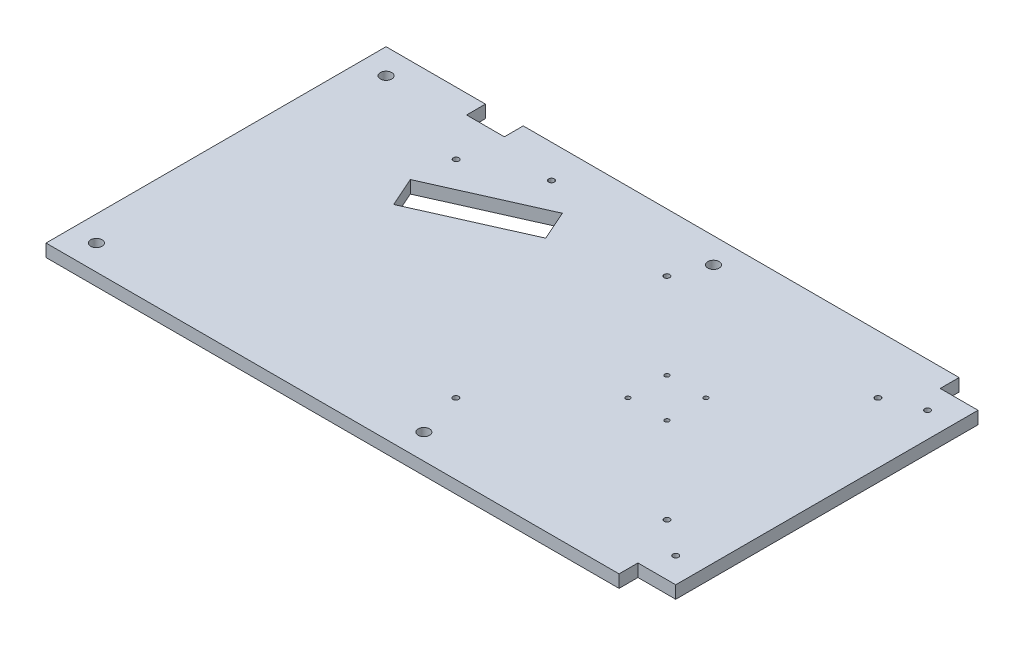
ISO-10303-21;
HEADER;
FILE_DESCRIPTION(('STEP AP214'),'2;1');
FILE_NAME('part.step','',(''),(''),'','','');
FILE_SCHEMA(('AUTOMOTIVE_DESIGN { 1 0 10303 214 1 1 1 1 }'));
ENDSEC;
DATA;
#1=APPLICATION_CONTEXT('core data for automotive mechanical design processes');
#2=APPLICATION_PROTOCOL_DEFINITION('international standard','automotive_design',2000,#1);
#3=PRODUCT_CONTEXT('',#1,'mechanical');
#4=PRODUCT('Part','Part','',(#3));
#5=PRODUCT_RELATED_PRODUCT_CATEGORY('part','',(#4));
#6=PRODUCT_DEFINITION_FORMATION('','',#4);
#7=PRODUCT_DEFINITION_CONTEXT('part definition',#1,'design');
#8=PRODUCT_DEFINITION('design','',#6,#7);
#9=PRODUCT_DEFINITION_SHAPE('','',#8);
#10=(LENGTH_UNIT() NAMED_UNIT(*) SI_UNIT(.MILLI.,.METRE.));
#11=(NAMED_UNIT(*) PLANE_ANGLE_UNIT() SI_UNIT($,.RADIAN.));
#12=(NAMED_UNIT(*) SI_UNIT($,.STERADIAN.) SOLID_ANGLE_UNIT());
#13=UNCERTAINTY_MEASURE_WITH_UNIT(LENGTH_MEASURE(1.E-05),#10,'distance_accuracy_value','');
#14=(GEOMETRIC_REPRESENTATION_CONTEXT(3) GLOBAL_UNCERTAINTY_ASSIGNED_CONTEXT((#13)) GLOBAL_UNIT_ASSIGNED_CONTEXT((#10,
#11,#12)) REPRESENTATION_CONTEXT('',''));
#15=CARTESIAN_POINT('',(0.,0.,0.));
#16=DIRECTION('',(0.,0.,1.));
#17=DIRECTION('',(1.,0.,0.));
#18=AXIS2_PLACEMENT_3D('',#15,#16,#17);
#19=CARTESIAN_POINT('',(0.,10.,-270.));
#20=DIRECTION('',(0.,0.,1.));
#21=DIRECTION('',(1.,0.,0.));
#22=AXIS2_PLACEMENT_3D('',#19,#20,#21);
#23=PLANE('',#22);
#24=DIRECTION('',(-1.,0.,0.));
#25=VECTOR('',#24,1.);
#26=CARTESIAN_POINT('',(0.,10.,-270.));
#27=LINE('',#26,#25);
#28=CARTESIAN_POINT('',(-406.074312,10.,-270.));
#29=VERTEX_POINT('',#28);
#30=CARTESIAN_POINT('',(-485.,10.,-270.));
#31=VERTEX_POINT('',#30);
#32=EDGE_CURVE('E317',#29,#31,#27,.T.);
#33=ORIENTED_EDGE('',*,*,#32,.F.);
#34=DIRECTION('',(0.,1.,0.));
#35=VECTOR('',#34,1.);
#36=CARTESIAN_POINT('',(-406.074312,0.,-270.));
#37=LINE('',#36,#35);
#38=CARTESIAN_POINT('',(-406.074312,0.,-270.));
#39=VERTEX_POINT('',#38);
#40=EDGE_CURVE('E337',#39,#29,#37,.T.);
#41=ORIENTED_EDGE('',*,*,#40,.F.);
#42=DIRECTION('',(-1.,0.,0.));
#43=VECTOR('',#42,1.);
#44=CARTESIAN_POINT('',(0.,0.,-270.));
#45=LINE('',#44,#43);
#46=CARTESIAN_POINT('',(-485.,0.,-270.));
#47=VERTEX_POINT('',#46);
#48=EDGE_CURVE('E187',#39,#47,#45,.T.);
#49=ORIENTED_EDGE('',*,*,#48,.T.);
#50=DIRECTION('',(0.,-1.,0.));
#51=VECTOR('',#50,1.);
#52=CARTESIAN_POINT('',(-485.,10.,-270.));
#53=LINE('',#52,#51);
#54=EDGE_CURVE('E11',#31,#47,#53,.T.);
#55=ORIENTED_EDGE('',*,*,#54,.F.);
#56=EDGE_LOOP('',(#33,#41,#49,#55));
#57=FACE_BOUND('',#56,.T.);
#58=ADVANCED_FACE('F37',(#57),#23,.F.);
#59=CARTESIAN_POINT('',(0.,10.,0.));
#60=DIRECTION('',(-1.,0.,0.));
#61=DIRECTION('',(0.,0.,1.));
#62=AXIS2_PLACEMENT_3D('',#59,#60,#61);
#63=PLANE('',#62);
#64=DIRECTION('',(0.,0.,-1.));
#65=VECTOR('',#64,1.);
#66=CARTESIAN_POINT('',(0.,10.,0.));
#67=LINE('',#66,#65);
#68=CARTESIAN_POINT('',(0.,10.,-15.));
#69=VERTEX_POINT('',#68);
#70=CARTESIAN_POINT('',(0.,10.,-255.));
#71=VERTEX_POINT('',#70);
#72=EDGE_CURVE('E193',#69,#71,#67,.T.);
#73=ORIENTED_EDGE('',*,*,#72,.F.);
#74=DIRECTION('',(0.,1.,0.));
#75=VECTOR('',#74,1.);
#76=CARTESIAN_POINT('',(0.,0.,-15.));
#77=LINE('',#76,#75);
#78=CARTESIAN_POINT('',(0.,0.,-15.));
#79=VERTEX_POINT('',#78);
#80=EDGE_CURVE('E501',#79,#69,#77,.T.);
#81=ORIENTED_EDGE('',*,*,#80,.F.);
#82=DIRECTION('',(0.,0.,-1.));
#83=VECTOR('',#82,1.);
#84=CARTESIAN_POINT('',(0.,0.,0.));
#85=LINE('',#84,#83);
#86=CARTESIAN_POINT('',(0.,0.,-255.));
#87=VERTEX_POINT('',#86);
#88=EDGE_CURVE('E184',#79,#87,#85,.T.);
#89=ORIENTED_EDGE('',*,*,#88,.T.);
#90=DIRECTION('',(0.,1.,0.));
#91=VECTOR('',#90,1.);
#92=CARTESIAN_POINT('',(0.,0.,-255.));
#93=LINE('',#92,#91);
#94=EDGE_CURVE('E230',#87,#71,#93,.T.);
#95=ORIENTED_EDGE('',*,*,#94,.T.);
#96=EDGE_LOOP('',(#73,#81,#89,#95));
#97=FACE_BOUND('',#96,.T.);
#98=ADVANCED_FACE('F39',(#97),#63,.F.);
#99=CARTESIAN_POINT('',(-30.,0.,-270.));
#100=VERTEX_POINT('',#99);
#101=CARTESIAN_POINT('',(-376.074312,0.,-270.));
#102=VERTEX_POINT('',#101);
#103=EDGE_CURVE('E190',#100,#102,#45,.T.);
#104=ORIENTED_EDGE('',*,*,#103,.T.);
#105=DIRECTION('',(0.,1.,0.));
#106=VECTOR('',#105,1.);
#107=CARTESIAN_POINT('',(-376.074312,0.,-270.));
#108=LINE('',#107,#106);
#109=CARTESIAN_POINT('',(-376.074312,10.,-270.));
#110=VERTEX_POINT('',#109);
#111=EDGE_CURVE('E335',#102,#110,#108,.T.);
#112=ORIENTED_EDGE('',*,*,#111,.T.);
#113=CARTESIAN_POINT('',(-30.,10.,-270.));
#114=VERTEX_POINT('',#113);
#115=EDGE_CURVE('E180',#114,#110,#27,.T.);
#116=ORIENTED_EDGE('',*,*,#115,.F.);
#117=DIRECTION('',(0.,1.,0.));
#118=VECTOR('',#117,1.);
#119=CARTESIAN_POINT('',(-30.,0.,-270.));
#120=LINE('',#119,#118);
#121=EDGE_CURVE('E233',#100,#114,#120,.T.);
#122=ORIENTED_EDGE('',*,*,#121,.F.);
#123=EDGE_LOOP('',(#104,#112,#116,#122));
#124=FACE_BOUND('',#123,.T.);
#125=ADVANCED_FACE('F333',(#124),#23,.F.);
#126=CARTESIAN_POINT('',(-485.,10.,0.));
#127=DIRECTION('',(1.,0.,0.));
#128=DIRECTION('',(0.,0.,-1.));
#129=AXIS2_PLACEMENT_3D('',#126,#127,#128);
#130=PLANE('',#129);
#131=DIRECTION('',(0.,0.,1.));
#132=VECTOR('',#131,1.);
#133=CARTESIAN_POINT('',(-485.,0.,0.));
#134=LINE('',#133,#132);
#135=CARTESIAN_POINT('',(-485.,0.,0.));
#136=VERTEX_POINT('',#135);
#137=EDGE_CURVE('E191',#47,#136,#134,.T.);
#138=ORIENTED_EDGE('',*,*,#137,.T.);
#139=DIRECTION('',(0.,-1.,0.));
#140=VECTOR('',#139,1.);
#141=CARTESIAN_POINT('',(-485.,10.,0.));
#142=LINE('',#141,#140);
#143=CARTESIAN_POINT('',(-485.,10.,0.));
#144=VERTEX_POINT('',#143);
#145=EDGE_CURVE('E46',#144,#136,#142,.T.);
#146=ORIENTED_EDGE('',*,*,#145,.F.);
#147=DIRECTION('',(0.,0.,1.));
#148=VECTOR('',#147,1.);
#149=CARTESIAN_POINT('',(-485.,10.,0.));
#150=LINE('',#149,#148);
#151=EDGE_CURVE('E176',#31,#144,#150,.T.);
#152=ORIENTED_EDGE('',*,*,#151,.F.);
#153=ORIENTED_EDGE('',*,*,#54,.T.);
#154=EDGE_LOOP('',(#138,#146,#152,#153));
#155=FACE_BOUND('',#154,.T.);
#156=ADVANCED_FACE('F403',(#155),#130,.F.);
#157=CARTESIAN_POINT('',(0.,10.,0.));
#158=DIRECTION('',(0.,0.,-1.));
#159=DIRECTION('',(-1.,0.,0.));
#160=AXIS2_PLACEMENT_3D('',#157,#158,#159);
#161=PLANE('',#160);
#162=DIRECTION('',(1.,0.,0.));
#163=VECTOR('',#162,1.);
#164=CARTESIAN_POINT('',(0.,0.,0.));
#165=LINE('',#164,#163);
#166=CARTESIAN_POINT('',(-30.,0.,0.));
#167=VERTEX_POINT('',#166);
#168=EDGE_CURVE('E169',#136,#167,#165,.T.);
#169=ORIENTED_EDGE('',*,*,#168,.T.);
#170=DIRECTION('',(0.,1.,0.));
#171=VECTOR('',#170,1.);
#172=CARTESIAN_POINT('',(-30.,0.,0.));
#173=LINE('',#172,#171);
#174=CARTESIAN_POINT('',(-30.,10.,0.));
#175=VERTEX_POINT('',#174);
#176=EDGE_CURVE('E153',#167,#175,#173,.T.);
#177=ORIENTED_EDGE('',*,*,#176,.T.);
#178=DIRECTION('',(1.,0.,0.));
#179=VECTOR('',#178,1.);
#180=CARTESIAN_POINT('',(0.,10.,0.));
#181=LINE('',#180,#179);
#182=EDGE_CURVE('E167',#144,#175,#181,.T.);
#183=ORIENTED_EDGE('',*,*,#182,.F.);
#184=ORIENTED_EDGE('',*,*,#145,.T.);
#185=EDGE_LOOP('',(#169,#177,#183,#184));
#186=FACE_BOUND('',#185,.T.);
#187=ADVANCED_FACE('F165',(#186),#161,.F.);
#188=CARTESIAN_POINT('',(0.,10.,0.));
#189=DIRECTION('',(0.,1.,0.));
#190=DIRECTION('',(0.,0.,1.));
#191=AXIS2_PLACEMENT_3D('',#188,#189,#190);
#192=PLANE('',#191);
#193=CARTESIAN_POINT('',(-20.,10.,-35.));
#194=DIRECTION('',(0.,1.,0.));
#195=DIRECTION('',(0.,0.,1.));
#196=AXIS2_PLACEMENT_3D('',#193,#194,#195);
#197=CIRCLE('',#196,2.25);
#198=CARTESIAN_POINT('',(-20.,10.,-32.75));
#199=VERTEX_POINT('',#198);
#200=EDGE_CURVE('E512',#199,#199,#197,.T.);
#201=ORIENTED_EDGE('',*,*,#200,.F.);
#202=EDGE_LOOP('',(#201));
#203=FACE_BOUND('',#202,.T.);
#204=CARTESIAN_POINT('',(-20.,10.,-235.));
#205=DIRECTION('',(0.,1.,0.));
#206=DIRECTION('',(0.,0.,1.));
#207=AXIS2_PLACEMENT_3D('',#204,#205,#206);
#208=CIRCLE('',#207,2.25);
#209=CARTESIAN_POINT('',(-20.,10.,-232.75));
#210=VERTEX_POINT('',#209);
#211=EDGE_CURVE('E509',#210,#210,#208,.T.);
#212=ORIENTED_EDGE('',*,*,#211,.F.);
#213=EDGE_LOOP('',(#212));
#214=FACE_BOUND('',#213,.T.);
#215=DIRECTION('',(0.,0.,1.));
#216=VECTOR('',#215,1.);
#217=CARTESIAN_POINT('',(-406.074312,10.,-255.));
#218=LINE('',#217,#216);
#219=CARTESIAN_POINT('',(-406.074312,10.,-255.));
#220=VERTEX_POINT('',#219);
#221=EDGE_CURVE('E170',#29,#220,#218,.T.);
#222=ORIENTED_EDGE('',*,*,#221,.F.);
#223=ORIENTED_EDGE('',*,*,#32,.T.);
#224=ORIENTED_EDGE('',*,*,#151,.T.);
#225=ORIENTED_EDGE('',*,*,#182,.T.);
#226=DIRECTION('',(0.,0.,1.));
#227=VECTOR('',#226,1.);
#228=CARTESIAN_POINT('',(-30.,10.,0.));
#229=LINE('',#228,#227);
#230=CARTESIAN_POINT('',(-30.,10.,-15.));
#231=VERTEX_POINT('',#230);
#232=EDGE_CURVE('E150',#231,#175,#229,.T.);
#233=ORIENTED_EDGE('',*,*,#232,.F.);
#234=DIRECTION('',(-1.,0.,0.));
#235=VECTOR('',#234,1.);
#236=CARTESIAN_POINT('',(0.,10.,-15.));
#237=LINE('',#236,#235);
#238=EDGE_CURVE('E159',#69,#231,#237,.T.);
#239=ORIENTED_EDGE('',*,*,#238,.F.);
#240=ORIENTED_EDGE('',*,*,#72,.T.);
#241=DIRECTION('',(1.,0.,0.));
#242=VECTOR('',#241,1.);
#243=CARTESIAN_POINT('',(0.,10.,-255.));
#244=LINE('',#243,#242);
#245=CARTESIAN_POINT('',(-30.,10.,-255.));
#246=VERTEX_POINT('',#245);
#247=EDGE_CURVE('E362',#246,#71,#244,.T.);
#248=ORIENTED_EDGE('',*,*,#247,.F.);
#249=DIRECTION('',(0.,0.,1.));
#250=VECTOR('',#249,1.);
#251=CARTESIAN_POINT('',(-30.,10.,-270.));
#252=LINE('',#251,#250);
#253=EDGE_CURVE('E328',#114,#246,#252,.T.);
#254=ORIENTED_EDGE('',*,*,#253,.F.);
#255=ORIENTED_EDGE('',*,*,#115,.T.);
#256=DIRECTION('',(0.,0.,-1.));
#257=VECTOR('',#256,1.);
#258=CARTESIAN_POINT('',(-376.074312,10.,-255.));
#259=LINE('',#258,#257);
#260=CARTESIAN_POINT('',(-376.074312,10.,-255.));
#261=VERTEX_POINT('',#260);
#262=EDGE_CURVE('E325',#261,#110,#259,.T.);
#263=ORIENTED_EDGE('',*,*,#262,.F.);
#264=DIRECTION('',(1.,0.,0.));
#265=VECTOR('',#264,1.);
#266=CARTESIAN_POINT('',(-406.074312,10.,-255.));
#267=LINE('',#266,#265);
#268=EDGE_CURVE('E346',#220,#261,#267,.T.);
#269=ORIENTED_EDGE('',*,*,#268,.F.);
#270=EDGE_LOOP('',(#222,#223,#224,#225,#233,#239,#240,#248,#254,#255,#263,#269));
#271=FACE_BOUND('',#270,.T.);
#272=CARTESIAN_POINT('',(-327.299756601943,10.,-243.651595894783));
#273=DIRECTION('',(0.,1.,0.));
#274=DIRECTION('',(0.,0.,1.));
#275=AXIS2_PLACEMENT_3D('',#272,#273,#274);
#276=CIRCLE('',#275,2.25000000000001);
#277=CARTESIAN_POINT('',(-327.299756601943,10.,-241.401595894783));
#278=VERTEX_POINT('',#277);
#279=EDGE_CURVE('E219',#278,#278,#276,.T.);
#280=ORIENTED_EDGE('',*,*,#279,.F.);
#281=EDGE_LOOP('',(#280));
#282=FACE_BOUND('',#281,.T.);
#283=CARTESIAN_POINT('',(-379.645911324864,10.,-220.345586246539));
#284=DIRECTION('',(0.,1.,0.));
#285=DIRECTION('',(0.,0.,1.));
#286=AXIS2_PLACEMENT_3D('',#283,#284,#285);
#287=CIRCLE('',#286,2.25000000000001);
#288=CARTESIAN_POINT('',(-379.645911324864,10.,-218.095586246539));
#289=VERTEX_POINT('',#288);
#290=EDGE_CURVE('E225',#289,#289,#287,.T.);
#291=ORIENTED_EDGE('',*,*,#290,.F.);
#292=EDGE_LOOP('',(#291));
#293=FACE_BOUND('',#292,.T.);
#294=CARTESIAN_POINT('',(-147.5,10.,-124.5));
#295=DIRECTION('',(0.,1.,0.));
#296=DIRECTION('',(0.,0.,1.));
#297=AXIS2_PLACEMENT_3D('',#294,#295,#296);
#298=CIRCLE('',#297,1.75000000000001);
#299=CARTESIAN_POINT('',(-147.5,10.,-122.75));
#300=VERTEX_POINT('',#299);
#301=EDGE_CURVE('E223',#300,#300,#298,.T.);
#302=ORIENTED_EDGE('',*,*,#301,.F.);
#303=EDGE_LOOP('',(#302));
#304=FACE_BOUND('',#303,.T.);
#305=CARTESIAN_POINT('',(-116.5,10.,-124.5));
#306=DIRECTION('',(0.,1.,0.));
#307=DIRECTION('',(0.,0.,1.));
#308=AXIS2_PLACEMENT_3D('',#305,#306,#307);
#309=CIRCLE('',#308,1.74999999999997);
#310=CARTESIAN_POINT('',(-116.5,10.,-122.75));
#311=VERTEX_POINT('',#310);
#312=EDGE_CURVE('E239',#311,#311,#309,.T.);
#313=ORIENTED_EDGE('',*,*,#312,.F.);
#314=EDGE_LOOP('',(#313));
#315=FACE_BOUND('',#314,.T.);
#316=CARTESIAN_POINT('',(-116.5,10.,-155.5));
#317=DIRECTION('',(0.,1.,0.));
#318=DIRECTION('',(0.,0.,1.));
#319=AXIS2_PLACEMENT_3D('',#316,#317,#318);
#320=CIRCLE('',#319,1.75);
#321=CARTESIAN_POINT('',(-116.5,10.,-153.75));
#322=VERTEX_POINT('',#321);
#323=EDGE_CURVE('E236',#322,#322,#320,.T.);
#324=ORIENTED_EDGE('',*,*,#323,.F.);
#325=EDGE_LOOP('',(#324));
#326=FACE_BOUND('',#325,.T.);
#327=CARTESIAN_POINT('',(-147.5,10.,-155.5));
#328=DIRECTION('',(0.,1.,0.));
#329=DIRECTION('',(0.,0.,1.));
#330=AXIS2_PLACEMENT_3D('',#327,#328,#329);
#331=CIRCLE('',#330,1.75000000000001);
#332=CARTESIAN_POINT('',(-147.5,10.,-153.75));
#333=VERTEX_POINT('',#332);
#334=EDGE_CURVE('E208',#333,#333,#331,.T.);
#335=ORIENTED_EDGE('',*,*,#334,.F.);
#336=EDGE_LOOP('',(#335));
#337=FACE_BOUND('',#336,.T.);
#338=CARTESIAN_POINT('',(-48.2078464293937,10.,-56.2078464293948));
#339=DIRECTION('',(0.,1.,0.));
#340=DIRECTION('',(0.,0.,1.));
#341=AXIS2_PLACEMENT_3D('',#338,#339,#340);
#342=CIRCLE('',#341,2.25000000000007);
#343=CARTESIAN_POINT('',(-48.2078464293937,10.,-53.9578464293948));
#344=VERTEX_POINT('',#343);
#345=EDGE_CURVE('E259',#344,#344,#342,.T.);
#346=ORIENTED_EDGE('',*,*,#345,.F.);
#347=EDGE_LOOP('',(#346));
#348=FACE_BOUND('',#347,.T.);
#349=CARTESIAN_POINT('',(-215.792153570606,10.,-223.792153570606));
#350=DIRECTION('',(0.,1.,0.));
#351=DIRECTION('',(0.,0.,1.));
#352=AXIS2_PLACEMENT_3D('',#349,#350,#351);
#353=CIRCLE('',#352,2.25000000000001);
#354=CARTESIAN_POINT('',(-215.792153570606,10.,-221.542153570606));
#355=VERTEX_POINT('',#354);
#356=EDGE_CURVE('E253',#355,#355,#353,.T.);
#357=ORIENTED_EDGE('',*,*,#356,.F.);
#358=EDGE_LOOP('',(#357));
#359=FACE_BOUND('',#358,.T.);
#360=CARTESIAN_POINT('',(-215.792153570605,10.,-56.207846429394));
#361=DIRECTION('',(0.,1.,0.));
#362=DIRECTION('',(0.,0.,1.));
#363=AXIS2_PLACEMENT_3D('',#360,#361,#362);
#364=CIRCLE('',#363,2.24999999999998);
#365=CARTESIAN_POINT('',(-215.792153570605,10.,-53.957846429394));
#366=VERTEX_POINT('',#365);
#367=EDGE_CURVE('E246',#366,#366,#364,.T.);
#368=ORIENTED_EDGE('',*,*,#367,.F.);
#369=EDGE_LOOP('',(#368));
#370=FACE_BOUND('',#369,.T.);
#371=CARTESIAN_POINT('',(-48.2078464293946,10.,-223.792153570607));
#372=DIRECTION('',(0.,1.,0.));
#373=DIRECTION('',(0.,0.,1.));
#374=AXIS2_PLACEMENT_3D('',#371,#372,#373);
#375=CIRCLE('',#374,2.25000000000002);
#376=CARTESIAN_POINT('',(-48.2078464293946,10.,-221.542153570607));
#377=VERTEX_POINT('',#376);
#378=EDGE_CURVE('E249',#377,#377,#375,.T.);
#379=ORIENTED_EDGE('',*,*,#378,.F.);
#380=EDGE_LOOP('',(#379));
#381=FACE_BOUND('',#380,.T.);
#382=DIRECTION('',(0.913545457642599,0.,-0.406736643075804));
#383=VECTOR('',#382,1.);
#384=CARTESIAN_POINT('',(-122.920536952595,10.0000000000001,-276.084046263576));
#385=LINE('',#384,#383);
#386=CARTESIAN_POINT('',(-373.483747125887,10.,-164.526117611434));
#387=VERTEX_POINT('',#386);
#388=CARTESIAN_POINT('',(-289.941100154142,10.,-201.721700489859));
#389=VERTEX_POINT('',#388);
#390=EDGE_CURVE('E282',#387,#389,#385,.T.);
#391=ORIENTED_EDGE('',*,*,#390,.F.);
#392=DIRECTION('',(-0.406736643075804,0.,-0.913545457642599));
#393=VECTOR('',#392,1.);
#394=CARTESIAN_POINT('',(-373.483747125887,10.,-164.526117611434));
#395=LINE('',#394,#393);
#396=CARTESIAN_POINT('',(-384.058899845858,10.,-188.278299510141));
#397=VERTEX_POINT('',#396);
#398=EDGE_CURVE('E296',#387,#397,#395,.T.);
#399=ORIENTED_EDGE('',*,*,#398,.T.);
#400=DIRECTION('',(0.913545457642599,0.,-0.406736643075804));
#401=VECTOR('',#400,1.);
#402=CARTESIAN_POINT('',(-133.495689672566,10.0000000000001,-299.836228162284));
#403=LINE('',#402,#401);
#404=CARTESIAN_POINT('',(-300.516252874113,10.,-225.473882388567));
#405=VERTEX_POINT('',#404);
#406=EDGE_CURVE('E271',#397,#405,#403,.T.);
#407=ORIENTED_EDGE('',*,*,#406,.T.);
#408=DIRECTION('',(-0.406736643075804,0.,-0.913545457642599));
#409=VECTOR('',#408,1.);
#410=CARTESIAN_POINT('',(-289.941100154142,10.,-201.721700489859));
#411=LINE('',#410,#409);
#412=EDGE_CURVE('E299',#389,#405,#411,.T.);
#413=ORIENTED_EDGE('',*,*,#412,.F.);
#414=EDGE_LOOP('',(#391,#399,#407,#413));
#415=FACE_BOUND('',#414,.T.);
#416=CARTESIAN_POINT('',(-465.,10.,-250.));
#417=DIRECTION('',(0.,1.,0.));
#418=DIRECTION('',(0.,0.,1.));
#419=AXIS2_PLACEMENT_3D('',#416,#417,#418);
#420=CIRCLE('',#419,4.5);
#421=CARTESIAN_POINT('',(-465.,10.,-245.5));
#422=VERTEX_POINT('',#421);
#423=EDGE_CURVE('E203',#422,#422,#420,.T.);
#424=ORIENTED_EDGE('',*,*,#423,.F.);
#425=EDGE_LOOP('',(#424));
#426=FACE_BOUND('',#425,.T.);
#427=CARTESIAN_POINT('',(-205.,10.,-19.9999999999999));
#428=DIRECTION('',(0.,1.,0.));
#429=DIRECTION('',(0.,0.,1.));
#430=AXIS2_PLACEMENT_3D('',#427,#428,#429);
#431=CIRCLE('',#430,4.49999999999998);
#432=CARTESIAN_POINT('',(-205.,10.,-15.5));
#433=VERTEX_POINT('',#432);
#434=EDGE_CURVE('E199',#433,#433,#431,.T.);
#435=ORIENTED_EDGE('',*,*,#434,.F.);
#436=EDGE_LOOP('',(#435));
#437=FACE_BOUND('',#436,.T.);
#438=CARTESIAN_POINT('',(-465.,10.,-19.9999999999999));
#439=DIRECTION('',(0.,1.,0.));
#440=DIRECTION('',(0.,0.,1.));
#441=AXIS2_PLACEMENT_3D('',#438,#439,#440);
#442=CIRCLE('',#441,4.5);
#443=CARTESIAN_POINT('',(-465.,10.,-15.4999999999999));
#444=VERTEX_POINT('',#443);
#445=EDGE_CURVE('E198',#444,#444,#442,.T.);
#446=ORIENTED_EDGE('',*,*,#445,.F.);
#447=EDGE_LOOP('',(#446));
#448=FACE_BOUND('',#447,.T.);
#449=CARTESIAN_POINT('',(-205.,10.,-250.));
#450=DIRECTION('',(0.,1.,0.));
#451=DIRECTION('',(0.,0.,1.));
#452=AXIS2_PLACEMENT_3D('',#449,#450,#451);
#453=CIRCLE('',#452,4.5);
#454=CARTESIAN_POINT('',(-205.,10.,-245.5));
#455=VERTEX_POINT('',#454);
#456=EDGE_CURVE('E311',#455,#455,#453,.T.);
#457=ORIENTED_EDGE('',*,*,#456,.F.);
#458=EDGE_LOOP('',(#457));
#459=FACE_BOUND('',#458,.T.);
#460=ADVANCED_FACE('F173',(#203,#214,#271,#282,#293,#304,#315,#326,#337,#348,#359,#370,#381,
#415,#426,#437,#448,#459),#192,.T.);
#461=CARTESIAN_POINT('',(0.,0.,0.));
#462=DIRECTION('',(0.,1.,0.));
#463=DIRECTION('',(0.,0.,1.));
#464=AXIS2_PLACEMENT_3D('',#461,#462,#463);
#465=PLANE('',#464);
#466=CARTESIAN_POINT('',(-20.,0.,-35.));
#467=DIRECTION('',(0.,1.,0.));
#468=DIRECTION('',(0.,0.,1.));
#469=AXIS2_PLACEMENT_3D('',#466,#467,#468);
#470=CIRCLE('',#469,2.25);
#471=CARTESIAN_POINT('',(-20.,0.,-32.75));
#472=VERTEX_POINT('',#471);
#473=EDGE_CURVE('E341',#472,#472,#470,.T.);
#474=ORIENTED_EDGE('',*,*,#473,.T.);
#475=EDGE_LOOP('',(#474));
#476=FACE_BOUND('',#475,.T.);
#477=CARTESIAN_POINT('',(-20.,0.,-235.));
#478=DIRECTION('',(0.,1.,0.));
#479=DIRECTION('',(0.,0.,1.));
#480=AXIS2_PLACEMENT_3D('',#477,#478,#479);
#481=CIRCLE('',#480,2.25);
#482=CARTESIAN_POINT('',(-20.,0.,-232.75));
#483=VERTEX_POINT('',#482);
#484=EDGE_CURVE('E506',#483,#483,#481,.T.);
#485=ORIENTED_EDGE('',*,*,#484,.T.);
#486=EDGE_LOOP('',(#485));
#487=FACE_BOUND('',#486,.T.);
#488=ORIENTED_EDGE('',*,*,#48,.F.);
#489=DIRECTION('',(0.,0.,1.));
#490=VECTOR('',#489,1.);
#491=CARTESIAN_POINT('',(-406.074312,0.,-255.));
#492=LINE('',#491,#490);
#493=CARTESIAN_POINT('',(-406.074312,0.,-255.));
#494=VERTEX_POINT('',#493);
#495=EDGE_CURVE('E347',#39,#494,#492,.T.);
#496=ORIENTED_EDGE('',*,*,#495,.T.);
#497=DIRECTION('',(1.,0.,0.));
#498=VECTOR('',#497,1.);
#499=CARTESIAN_POINT('',(-406.074312,0.,-255.));
#500=LINE('',#499,#498);
#501=CARTESIAN_POINT('',(-376.074312,0.,-255.));
#502=VERTEX_POINT('',#501);
#503=EDGE_CURVE('E353',#494,#502,#500,.T.);
#504=ORIENTED_EDGE('',*,*,#503,.T.);
#505=DIRECTION('',(0.,0.,-1.));
#506=VECTOR('',#505,1.);
#507=CARTESIAN_POINT('',(-376.074312,0.,-255.));
#508=LINE('',#507,#506);
#509=EDGE_CURVE('E54',#502,#102,#508,.T.);
#510=ORIENTED_EDGE('',*,*,#509,.T.);
#511=ORIENTED_EDGE('',*,*,#103,.F.);
#512=DIRECTION('',(0.,0.,1.));
#513=VECTOR('',#512,1.);
#514=CARTESIAN_POINT('',(-30.,0.,-270.));
#515=LINE('',#514,#513);
#516=CARTESIAN_POINT('',(-30.,0.,-255.));
#517=VERTEX_POINT('',#516);
#518=EDGE_CURVE('E358',#100,#517,#515,.T.);
#519=ORIENTED_EDGE('',*,*,#518,.T.);
#520=DIRECTION('',(1.,0.,0.));
#521=VECTOR('',#520,1.);
#522=CARTESIAN_POINT('',(0.,0.,-255.));
#523=LINE('',#522,#521);
#524=EDGE_CURVE('E361',#517,#87,#523,.T.);
#525=ORIENTED_EDGE('',*,*,#524,.T.);
#526=ORIENTED_EDGE('',*,*,#88,.F.);
#527=DIRECTION('',(-1.,0.,0.));
#528=VECTOR('',#527,1.);
#529=CARTESIAN_POINT('',(0.,0.,-15.));
#530=LINE('',#529,#528);
#531=CARTESIAN_POINT('',(-30.,0.,-15.));
#532=VERTEX_POINT('',#531);
#533=EDGE_CURVE('E160',#79,#532,#530,.T.);
#534=ORIENTED_EDGE('',*,*,#533,.T.);
#535=DIRECTION('',(0.,0.,1.));
#536=VECTOR('',#535,1.);
#537=CARTESIAN_POINT('',(-30.,0.,0.));
#538=LINE('',#537,#536);
#539=EDGE_CURVE('E62',#532,#167,#538,.T.);
#540=ORIENTED_EDGE('',*,*,#539,.T.);
#541=ORIENTED_EDGE('',*,*,#168,.F.);
#542=ORIENTED_EDGE('',*,*,#137,.F.);
#543=EDGE_LOOP('',(#488,#496,#504,#510,#511,#519,#525,#526,#534,#540,#541,#542));
#544=FACE_BOUND('',#543,.T.);
#545=CARTESIAN_POINT('',(-327.299756601943,0.,-243.651595894783));
#546=DIRECTION('',(0.,1.,0.));
#547=DIRECTION('',(0.,0.,1.));
#548=AXIS2_PLACEMENT_3D('',#545,#546,#547);
#549=CIRCLE('',#548,2.25000000000001);
#550=CARTESIAN_POINT('',(-327.299756601943,0.,-241.401595894783));
#551=VERTEX_POINT('',#550);
#552=EDGE_CURVE('E41',#551,#551,#549,.T.);
#553=ORIENTED_EDGE('',*,*,#552,.T.);
#554=EDGE_LOOP('',(#553));
#555=FACE_BOUND('',#554,.T.);
#556=CARTESIAN_POINT('',(-379.645911324864,0.,-220.345586246539));
#557=DIRECTION('',(0.,1.,0.));
#558=DIRECTION('',(0.,0.,1.));
#559=AXIS2_PLACEMENT_3D('',#556,#557,#558);
#560=CIRCLE('',#559,2.25000000000001);
#561=CARTESIAN_POINT('',(-379.645911324864,0.,-218.095586246539));
#562=VERTEX_POINT('',#561);
#563=EDGE_CURVE('E217',#562,#562,#560,.T.);
#564=ORIENTED_EDGE('',*,*,#563,.T.);
#565=EDGE_LOOP('',(#564));
#566=FACE_BOUND('',#565,.T.);
#567=CARTESIAN_POINT('',(-147.5,0.,-124.5));
#568=DIRECTION('',(0.,1.,0.));
#569=DIRECTION('',(0.,0.,1.));
#570=AXIS2_PLACEMENT_3D('',#567,#568,#569);
#571=CIRCLE('',#570,1.75000000000001);
#572=CARTESIAN_POINT('',(-147.5,0.,-122.75));
#573=VERTEX_POINT('',#572);
#574=EDGE_CURVE('E214',#573,#573,#571,.T.);
#575=ORIENTED_EDGE('',*,*,#574,.T.);
#576=EDGE_LOOP('',(#575));
#577=FACE_BOUND('',#576,.T.);
#578=CARTESIAN_POINT('',(-116.5,0.,-124.5));
#579=DIRECTION('',(0.,1.,0.));
#580=DIRECTION('',(0.,0.,1.));
#581=AXIS2_PLACEMENT_3D('',#578,#579,#580);
#582=CIRCLE('',#581,1.74999999999997);
#583=CARTESIAN_POINT('',(-116.5,0.,-122.75));
#584=VERTEX_POINT('',#583);
#585=EDGE_CURVE('E211',#584,#584,#582,.T.);
#586=ORIENTED_EDGE('',*,*,#585,.T.);
#587=EDGE_LOOP('',(#586));
#588=FACE_BOUND('',#587,.T.);
#589=CARTESIAN_POINT('',(-116.5,0.,-155.5));
#590=DIRECTION('',(0.,1.,0.));
#591=DIRECTION('',(0.,0.,1.));
#592=AXIS2_PLACEMENT_3D('',#589,#590,#591);
#593=CIRCLE('',#592,1.75);
#594=CARTESIAN_POINT('',(-116.5,0.,-153.75));
#595=VERTEX_POINT('',#594);
#596=EDGE_CURVE('E207',#595,#595,#593,.T.);
#597=ORIENTED_EDGE('',*,*,#596,.T.);
#598=EDGE_LOOP('',(#597));
#599=FACE_BOUND('',#598,.T.);
#600=CARTESIAN_POINT('',(-147.5,0.,-155.5));
#601=DIRECTION('',(0.,1.,0.));
#602=DIRECTION('',(0.,0.,1.));
#603=AXIS2_PLACEMENT_3D('',#600,#601,#602);
#604=CIRCLE('',#603,1.75000000000001);
#605=CARTESIAN_POINT('',(-147.5,0.,-153.75));
#606=VERTEX_POINT('',#605);
#607=EDGE_CURVE('E204',#606,#606,#604,.T.);
#608=ORIENTED_EDGE('',*,*,#607,.T.);
#609=EDGE_LOOP('',(#608));
#610=FACE_BOUND('',#609,.T.);
#611=CARTESIAN_POINT('',(-48.2078464293937,0.,-56.2078464293948));
#612=DIRECTION('',(0.,1.,0.));
#613=DIRECTION('',(0.,0.,1.));
#614=AXIS2_PLACEMENT_3D('',#611,#612,#613);
#615=CIRCLE('',#614,2.25000000000007);
#616=CARTESIAN_POINT('',(-48.2078464293937,0.,-53.9578464293948));
#617=VERTEX_POINT('',#616);
#618=EDGE_CURVE('E216',#617,#617,#615,.T.);
#619=ORIENTED_EDGE('',*,*,#618,.T.);
#620=EDGE_LOOP('',(#619));
#621=FACE_BOUND('',#620,.T.);
#622=CARTESIAN_POINT('',(-215.792153570606,0.,-223.792153570606));
#623=DIRECTION('',(0.,1.,0.));
#624=DIRECTION('',(0.,0.,1.));
#625=AXIS2_PLACEMENT_3D('',#622,#623,#624);
#626=CIRCLE('',#625,2.25000000000001);
#627=CARTESIAN_POINT('',(-215.792153570606,0.,-221.542153570606));
#628=VERTEX_POINT('',#627);
#629=EDGE_CURVE('E256',#628,#628,#626,.T.);
#630=ORIENTED_EDGE('',*,*,#629,.T.);
#631=EDGE_LOOP('',(#630));
#632=FACE_BOUND('',#631,.T.);
#633=CARTESIAN_POINT('',(-215.792153570605,0.,-56.207846429394));
#634=DIRECTION('',(0.,1.,0.));
#635=DIRECTION('',(0.,0.,1.));
#636=AXIS2_PLACEMENT_3D('',#633,#634,#635);
#637=CIRCLE('',#636,2.24999999999998);
#638=CARTESIAN_POINT('',(-215.792153570605,0.,-53.957846429394));
#639=VERTEX_POINT('',#638);
#640=EDGE_CURVE('E250',#639,#639,#637,.T.);
#641=ORIENTED_EDGE('',*,*,#640,.T.);
#642=EDGE_LOOP('',(#641));
#643=FACE_BOUND('',#642,.T.);
#644=CARTESIAN_POINT('',(-48.2078464293946,0.,-223.792153570607));
#645=DIRECTION('',(0.,1.,0.));
#646=DIRECTION('',(0.,0.,1.));
#647=AXIS2_PLACEMENT_3D('',#644,#645,#646);
#648=CIRCLE('',#647,2.25000000000002);
#649=CARTESIAN_POINT('',(-48.2078464293946,0.,-221.542153570607));
#650=VERTEX_POINT('',#649);
#651=EDGE_CURVE('E264',#650,#650,#648,.T.);
#652=ORIENTED_EDGE('',*,*,#651,.T.);
#653=EDGE_LOOP('',(#652));
#654=FACE_BOUND('',#653,.T.);
#655=DIRECTION('',(-0.406736643075804,0.,-0.913545457642599));
#656=VECTOR('',#655,1.);
#657=CARTESIAN_POINT('',(-373.483747125887,0.,-164.526117611434));
#658=LINE('',#657,#656);
#659=CARTESIAN_POINT('',(-373.483747125887,0.,-164.526117611434));
#660=VERTEX_POINT('',#659);
#661=CARTESIAN_POINT('',(-384.058899845858,0.,-188.278299510141));
#662=VERTEX_POINT('',#661);
#663=EDGE_CURVE('E293',#660,#662,#658,.T.);
#664=ORIENTED_EDGE('',*,*,#663,.F.);
#665=DIRECTION('',(0.913545457642599,0.,-0.406736643075804));
#666=VECTOR('',#665,1.);
#667=CARTESIAN_POINT('',(-122.920536952595,0.,-276.084046263576));
#668=LINE('',#667,#666);
#669=CARTESIAN_POINT('',(-289.941100154142,0.,-201.721700489859));
#670=VERTEX_POINT('',#669);
#671=EDGE_CURVE('E287',#660,#670,#668,.T.);
#672=ORIENTED_EDGE('',*,*,#671,.T.);
#673=DIRECTION('',(-0.406736643075804,0.,-0.913545457642599));
#674=VECTOR('',#673,1.);
#675=CARTESIAN_POINT('',(-289.941100154142,0.,-201.721700489859));
#676=LINE('',#675,#674);
#677=CARTESIAN_POINT('',(-300.516252874113,0.,-225.473882388567));
#678=VERTEX_POINT('',#677);
#679=EDGE_CURVE('E290',#670,#678,#676,.T.);
#680=ORIENTED_EDGE('',*,*,#679,.T.);
#681=DIRECTION('',(0.913545457642599,0.,-0.406736643075804));
#682=VECTOR('',#681,1.);
#683=CARTESIAN_POINT('',(-133.495689672566,0.,-299.836228162284));
#684=LINE('',#683,#682);
#685=EDGE_CURVE('E276',#662,#678,#684,.T.);
#686=ORIENTED_EDGE('',*,*,#685,.F.);
#687=EDGE_LOOP('',(#664,#672,#680,#686));
#688=FACE_BOUND('',#687,.T.);
#689=CARTESIAN_POINT('',(-465.,0.,-250.));
#690=DIRECTION('',(0.,1.,0.));
#691=DIRECTION('',(0.,0.,1.));
#692=AXIS2_PLACEMENT_3D('',#689,#690,#691);
#693=CIRCLE('',#692,4.49999999999998);
#694=CARTESIAN_POINT('',(-465.,0.,-245.5));
#695=VERTEX_POINT('',#694);
#696=EDGE_CURVE('E200',#695,#695,#693,.T.);
#697=ORIENTED_EDGE('',*,*,#696,.T.);
#698=EDGE_LOOP('',(#697));
#699=FACE_BOUND('',#698,.T.);
#700=CARTESIAN_POINT('',(-205.,0.,-19.9999999999999));
#701=DIRECTION('',(0.,1.,0.));
#702=DIRECTION('',(0.,0.,1.));
#703=AXIS2_PLACEMENT_3D('',#700,#701,#702);
#704=CIRCLE('',#703,4.49999999999998);
#705=CARTESIAN_POINT('',(-205.,0.,-15.5));
#706=VERTEX_POINT('',#705);
#707=EDGE_CURVE('E195',#706,#706,#704,.T.);
#708=ORIENTED_EDGE('',*,*,#707,.T.);
#709=EDGE_LOOP('',(#708));
#710=FACE_BOUND('',#709,.T.);
#711=CARTESIAN_POINT('',(-465.,0.,-19.9999999999999));
#712=DIRECTION('',(0.,1.,0.));
#713=DIRECTION('',(0.,0.,1.));
#714=AXIS2_PLACEMENT_3D('',#711,#712,#713);
#715=CIRCLE('',#714,4.49999999999998);
#716=CARTESIAN_POINT('',(-465.,0.,-15.5));
#717=VERTEX_POINT('',#716);
#718=EDGE_CURVE('E308',#717,#717,#715,.T.);
#719=ORIENTED_EDGE('',*,*,#718,.T.);
#720=EDGE_LOOP('',(#719));
#721=FACE_BOUND('',#720,.T.);
#722=CARTESIAN_POINT('',(-205.,0.,-250.));
#723=DIRECTION('',(0.,1.,0.));
#724=DIRECTION('',(0.,0.,1.));
#725=AXIS2_PLACEMENT_3D('',#722,#723,#724);
#726=CIRCLE('',#725,4.49999999999999);
#727=CARTESIAN_POINT('',(-205.,0.,-245.5));
#728=VERTEX_POINT('',#727);
#729=EDGE_CURVE('E188',#728,#728,#726,.T.);
#730=ORIENTED_EDGE('',*,*,#729,.T.);
#731=EDGE_LOOP('',(#730));
#732=FACE_BOUND('',#731,.T.);
#733=ADVANCED_FACE('F375',(#476,#487,#544,#555,#566,#577,#588,#599,#610,#621,#632,#643,#654,
#688,#699,#710,#721,#732),#465,.F.);
#734=CARTESIAN_POINT('',(-205.,10.,-250.));
#735=DIRECTION('',(0.,1.,0.));
#736=DIRECTION('',(0.,0.,1.));
#737=AXIS2_PLACEMENT_3D('',#734,#735,#736);
#738=CYLINDRICAL_SURFACE('',#737,4.49999999999999);
#739=ORIENTED_EDGE('',*,*,#456,.T.);
#740=EDGE_LOOP('',(#739));
#741=FACE_BOUND('',#740,.T.);
#742=ORIENTED_EDGE('',*,*,#729,.F.);
#743=EDGE_LOOP('',(#742));
#744=FACE_BOUND('',#743,.T.);
#745=ADVANCED_FACE('F415',(#741,#744),#738,.F.);
#746=CARTESIAN_POINT('',(-465.,10.,-19.9999999999999));
#747=DIRECTION('',(0.,1.,0.));
#748=DIRECTION('',(0.,0.,1.));
#749=AXIS2_PLACEMENT_3D('',#746,#747,#748);
#750=CYLINDRICAL_SURFACE('',#749,4.49999999999998);
#751=ORIENTED_EDGE('',*,*,#445,.T.);
#752=EDGE_LOOP('',(#751));
#753=FACE_BOUND('',#752,.T.);
#754=ORIENTED_EDGE('',*,*,#718,.F.);
#755=EDGE_LOOP('',(#754));
#756=FACE_BOUND('',#755,.T.);
#757=ADVANCED_FACE('F422',(#753,#756),#750,.F.);
#758=CARTESIAN_POINT('',(-205.,10.,-19.9999999999999));
#759=DIRECTION('',(0.,1.,0.));
#760=DIRECTION('',(0.,0.,1.));
#761=AXIS2_PLACEMENT_3D('',#758,#759,#760);
#762=CYLINDRICAL_SURFACE('',#761,4.49999999999998);
#763=ORIENTED_EDGE('',*,*,#434,.T.);
#764=EDGE_LOOP('',(#763));
#765=FACE_BOUND('',#764,.T.);
#766=ORIENTED_EDGE('',*,*,#707,.F.);
#767=EDGE_LOOP('',(#766));
#768=FACE_BOUND('',#767,.T.);
#769=ADVANCED_FACE('F426',(#765,#768),#762,.F.);
#770=CARTESIAN_POINT('',(-465.,10.,-250.));
#771=DIRECTION('',(0.,1.,0.));
#772=DIRECTION('',(0.,0.,1.));
#773=AXIS2_PLACEMENT_3D('',#770,#771,#772);
#774=CYLINDRICAL_SURFACE('',#773,4.49999999999998);
#775=ORIENTED_EDGE('',*,*,#423,.T.);
#776=EDGE_LOOP('',(#775));
#777=FACE_BOUND('',#776,.T.);
#778=ORIENTED_EDGE('',*,*,#696,.F.);
#779=EDGE_LOOP('',(#778));
#780=FACE_BOUND('',#779,.T.);
#781=ADVANCED_FACE('F430',(#777,#780),#774,.F.);
#782=CARTESIAN_POINT('',(-289.941100154142,0.,-201.721700489859));
#783=DIRECTION('',(0.913545457642599,0.,-0.406736643075804));
#784=DIRECTION('',(-0.406736643075804,0.,-0.913545457642599));
#785=AXIS2_PLACEMENT_3D('',#782,#783,#784);
#786=PLANE('',#785);
#787=ORIENTED_EDGE('',*,*,#679,.F.);
#788=DIRECTION('',(0.,-1.,0.));
#789=VECTOR('',#788,1.);
#790=CARTESIAN_POINT('',(-289.941100154142,0.,-201.721700489859));
#791=LINE('',#790,#789);
#792=EDGE_CURVE('E279',#389,#670,#791,.T.);
#793=ORIENTED_EDGE('',*,*,#792,.F.);
#794=ORIENTED_EDGE('',*,*,#412,.T.);
#795=DIRECTION('',(0.,-1.,0.));
#796=VECTOR('',#795,1.);
#797=CARTESIAN_POINT('',(-300.516252874113,0.,-225.473882388567));
#798=LINE('',#797,#796);
#799=EDGE_CURVE('E267',#405,#678,#798,.T.);
#800=ORIENTED_EDGE('',*,*,#799,.T.);
#801=EDGE_LOOP('',(#787,#793,#794,#800));
#802=FACE_BOUND('',#801,.T.);
#803=ADVANCED_FACE('F434',(#802),#786,.F.);
#804=CARTESIAN_POINT('',(-373.483747125887,0.,-164.526117611434));
#805=DIRECTION('',(0.913545457642599,0.,-0.406736643075804));
#806=DIRECTION('',(-0.406736643075804,0.,-0.913545457642599));
#807=AXIS2_PLACEMENT_3D('',#804,#805,#806);
#808=PLANE('',#807);
#809=ORIENTED_EDGE('',*,*,#398,.F.);
#810=DIRECTION('',(0.,-1.,0.));
#811=VECTOR('',#810,1.);
#812=CARTESIAN_POINT('',(-373.483747125887,0.,-164.526117611434));
#813=LINE('',#812,#811);
#814=EDGE_CURVE('E285',#387,#660,#813,.T.);
#815=ORIENTED_EDGE('',*,*,#814,.T.);
#816=ORIENTED_EDGE('',*,*,#663,.T.);
#817=DIRECTION('',(0.,-1.,0.));
#818=VECTOR('',#817,1.);
#819=CARTESIAN_POINT('',(-384.058899845858,0.,-188.278299510141));
#820=LINE('',#819,#818);
#821=EDGE_CURVE('E274',#397,#662,#820,.T.);
#822=ORIENTED_EDGE('',*,*,#821,.F.);
#823=EDGE_LOOP('',(#809,#815,#816,#822));
#824=FACE_BOUND('',#823,.T.);
#825=ADVANCED_FACE('F438',(#824),#808,.T.);
#826=CARTESIAN_POINT('',(-122.920536952595,0.,-276.084046263576));
#827=DIRECTION('',(0.406736643075804,0.,0.913545457642599));
#828=DIRECTION('',(0.913545457642599,0.,-0.406736643075804));
#829=AXIS2_PLACEMENT_3D('',#826,#827,#828);
#830=PLANE('',#829);
#831=ORIENTED_EDGE('',*,*,#792,.T.);
#832=ORIENTED_EDGE('',*,*,#671,.F.);
#833=ORIENTED_EDGE('',*,*,#814,.F.);
#834=ORIENTED_EDGE('',*,*,#390,.T.);
#835=EDGE_LOOP('',(#831,#832,#833,#834));
#836=FACE_BOUND('',#835,.T.);
#837=ADVANCED_FACE('F442',(#836),#830,.F.);
#838=CARTESIAN_POINT('',(-133.495689672566,0.,-299.836228162284));
#839=DIRECTION('',(0.406736643075804,0.,0.913545457642599));
#840=DIRECTION('',(0.913545457642599,0.,-0.406736643075804));
#841=AXIS2_PLACEMENT_3D('',#838,#839,#840);
#842=PLANE('',#841);
#843=ORIENTED_EDGE('',*,*,#799,.F.);
#844=ORIENTED_EDGE('',*,*,#406,.F.);
#845=ORIENTED_EDGE('',*,*,#821,.T.);
#846=ORIENTED_EDGE('',*,*,#685,.T.);
#847=EDGE_LOOP('',(#843,#844,#845,#846));
#848=FACE_BOUND('',#847,.T.);
#849=ADVANCED_FACE('F446',(#848),#842,.T.);
#850=CARTESIAN_POINT('',(-48.2078464293946,0.,-223.792153570607));
#851=DIRECTION('',(0.,1.,0.));
#852=DIRECTION('',(0.,0.,1.));
#853=AXIS2_PLACEMENT_3D('',#850,#851,#852);
#854=CYLINDRICAL_SURFACE('',#853,2.25000000000002);
#855=ORIENTED_EDGE('',*,*,#651,.F.);
#856=EDGE_LOOP('',(#855));
#857=FACE_BOUND('',#856,.T.);
#858=ORIENTED_EDGE('',*,*,#378,.T.);
#859=EDGE_LOOP('',(#858));
#860=FACE_BOUND('',#859,.T.);
#861=ADVANCED_FACE('F450',(#857,#860),#854,.F.);
#862=CARTESIAN_POINT('',(-215.792153570605,0.,-56.207846429394));
#863=DIRECTION('',(0.,1.,0.));
#864=DIRECTION('',(0.,0.,1.));
#865=AXIS2_PLACEMENT_3D('',#862,#863,#864);
#866=CYLINDRICAL_SURFACE('',#865,2.24999999999998);
#867=ORIENTED_EDGE('',*,*,#640,.F.);
#868=EDGE_LOOP('',(#867));
#869=FACE_BOUND('',#868,.T.);
#870=ORIENTED_EDGE('',*,*,#367,.T.);
#871=EDGE_LOOP('',(#870));
#872=FACE_BOUND('',#871,.T.);
#873=ADVANCED_FACE('F454',(#869,#872),#866,.F.);
#874=CARTESIAN_POINT('',(-215.792153570606,0.,-223.792153570606));
#875=DIRECTION('',(0.,1.,0.));
#876=DIRECTION('',(0.,0.,1.));
#877=AXIS2_PLACEMENT_3D('',#874,#875,#876);
#878=CYLINDRICAL_SURFACE('',#877,2.25000000000001);
#879=ORIENTED_EDGE('',*,*,#629,.F.);
#880=EDGE_LOOP('',(#879));
#881=FACE_BOUND('',#880,.T.);
#882=ORIENTED_EDGE('',*,*,#356,.T.);
#883=EDGE_LOOP('',(#882));
#884=FACE_BOUND('',#883,.T.);
#885=ADVANCED_FACE('F460',(#881,#884),#878,.F.);
#886=CARTESIAN_POINT('',(-48.2078464293937,0.,-56.2078464293948));
#887=DIRECTION('',(0.,1.,0.));
#888=DIRECTION('',(0.,0.,1.));
#889=AXIS2_PLACEMENT_3D('',#886,#887,#888);
#890=CYLINDRICAL_SURFACE('',#889,2.25000000000007);
#891=ORIENTED_EDGE('',*,*,#618,.F.);
#892=EDGE_LOOP('',(#891));
#893=FACE_BOUND('',#892,.T.);
#894=ORIENTED_EDGE('',*,*,#345,.T.);
#895=EDGE_LOOP('',(#894));
#896=FACE_BOUND('',#895,.T.);
#897=ADVANCED_FACE('F456',(#893,#896),#890,.F.);
#898=CARTESIAN_POINT('',(-147.5,-5.,-155.5));
#899=DIRECTION('',(0.,1.,0.));
#900=DIRECTION('',(0.,0.,1.));
#901=AXIS2_PLACEMENT_3D('',#898,#899,#900);
#902=CYLINDRICAL_SURFACE('',#901,1.75000000000001);
#903=ORIENTED_EDGE('',*,*,#334,.T.);
#904=EDGE_LOOP('',(#903));
#905=FACE_BOUND('',#904,.T.);
#906=ORIENTED_EDGE('',*,*,#607,.F.);
#907=EDGE_LOOP('',(#906));
#908=FACE_BOUND('',#907,.T.);
#909=ADVANCED_FACE('F459',(#905,#908),#902,.F.);
#910=CARTESIAN_POINT('',(-116.5,-5.,-155.5));
#911=DIRECTION('',(0.,1.,0.));
#912=DIRECTION('',(0.,0.,1.));
#913=AXIS2_PLACEMENT_3D('',#910,#911,#912);
#914=CYLINDRICAL_SURFACE('',#913,1.75);
#915=ORIENTED_EDGE('',*,*,#323,.T.);
#916=EDGE_LOOP('',(#915));
#917=FACE_BOUND('',#916,.T.);
#918=ORIENTED_EDGE('',*,*,#596,.F.);
#919=EDGE_LOOP('',(#918));
#920=FACE_BOUND('',#919,.T.);
#921=ADVANCED_FACE('F470',(#917,#920),#914,.F.);
#922=CARTESIAN_POINT('',(-116.5,-5.,-124.5));
#923=DIRECTION('',(0.,1.,0.));
#924=DIRECTION('',(0.,0.,1.));
#925=AXIS2_PLACEMENT_3D('',#922,#923,#924);
#926=CYLINDRICAL_SURFACE('',#925,1.74999999999997);
#927=ORIENTED_EDGE('',*,*,#312,.T.);
#928=EDGE_LOOP('',(#927));
#929=FACE_BOUND('',#928,.T.);
#930=ORIENTED_EDGE('',*,*,#585,.F.);
#931=EDGE_LOOP('',(#930));
#932=FACE_BOUND('',#931,.T.);
#933=ADVANCED_FACE('F476',(#929,#932),#926,.F.);
#934=CARTESIAN_POINT('',(-147.5,-5.,-124.5));
#935=DIRECTION('',(0.,1.,0.));
#936=DIRECTION('',(0.,0.,1.));
#937=AXIS2_PLACEMENT_3D('',#934,#935,#936);
#938=CYLINDRICAL_SURFACE('',#937,1.75000000000001);
#939=ORIENTED_EDGE('',*,*,#301,.T.);
#940=EDGE_LOOP('',(#939));
#941=FACE_BOUND('',#940,.T.);
#942=ORIENTED_EDGE('',*,*,#574,.F.);
#943=EDGE_LOOP('',(#942));
#944=FACE_BOUND('',#943,.T.);
#945=ADVANCED_FACE('F472',(#941,#944),#938,.F.);
#946=CARTESIAN_POINT('',(-379.645911324864,-32.3,-220.345586246539));
#947=DIRECTION('',(0.,1.,0.));
#948=DIRECTION('',(0.,0.,1.));
#949=AXIS2_PLACEMENT_3D('',#946,#947,#948);
#950=CYLINDRICAL_SURFACE('',#949,2.25000000000001);
#951=ORIENTED_EDGE('',*,*,#290,.T.);
#952=EDGE_LOOP('',(#951));
#953=FACE_BOUND('',#952,.T.);
#954=ORIENTED_EDGE('',*,*,#563,.F.);
#955=EDGE_LOOP('',(#954));
#956=FACE_BOUND('',#955,.T.);
#957=ADVANCED_FACE('F475',(#953,#956),#950,.F.);
#958=CARTESIAN_POINT('',(-327.299756601943,-32.3,-243.651595894783));
#959=DIRECTION('',(0.,1.,0.));
#960=DIRECTION('',(0.,0.,1.));
#961=AXIS2_PLACEMENT_3D('',#958,#959,#960);
#962=CYLINDRICAL_SURFACE('',#961,2.25000000000001);
#963=ORIENTED_EDGE('',*,*,#279,.T.);
#964=EDGE_LOOP('',(#963));
#965=FACE_BOUND('',#964,.T.);
#966=ORIENTED_EDGE('',*,*,#552,.F.);
#967=EDGE_LOOP('',(#966));
#968=FACE_BOUND('',#967,.T.);
#969=ADVANCED_FACE('F486',(#965,#968),#962,.F.);
#970=CARTESIAN_POINT('',(0.,0.,-255.));
#971=DIRECTION('',(0.,0.,1.));
#972=DIRECTION('',(1.,0.,0.));
#973=AXIS2_PLACEMENT_3D('',#970,#971,#972);
#974=PLANE('',#973);
#975=ORIENTED_EDGE('',*,*,#247,.T.);
#976=ORIENTED_EDGE('',*,*,#94,.F.);
#977=ORIENTED_EDGE('',*,*,#524,.F.);
#978=DIRECTION('',(0.,1.,0.));
#979=VECTOR('',#978,1.);
#980=CARTESIAN_POINT('',(-30.,0.,-255.));
#981=LINE('',#980,#979);
#982=EDGE_CURVE('E368',#517,#246,#981,.T.);
#983=ORIENTED_EDGE('',*,*,#982,.T.);
#984=EDGE_LOOP('',(#975,#976,#977,#983));
#985=FACE_BOUND('',#984,.T.);
#986=ADVANCED_FACE('F490',(#985),#974,.F.);
#987=CARTESIAN_POINT('',(-30.,0.,-270.));
#988=DIRECTION('',(-1.,0.,0.));
#989=DIRECTION('',(0.,0.,1.));
#990=AXIS2_PLACEMENT_3D('',#987,#988,#989);
#991=PLANE('',#990);
#992=ORIENTED_EDGE('',*,*,#253,.T.);
#993=ORIENTED_EDGE('',*,*,#982,.F.);
#994=ORIENTED_EDGE('',*,*,#518,.F.);
#995=ORIENTED_EDGE('',*,*,#121,.T.);
#996=EDGE_LOOP('',(#992,#993,#994,#995));
#997=FACE_BOUND('',#996,.T.);
#998=ADVANCED_FACE('F372',(#997),#991,.F.);
#999=CARTESIAN_POINT('',(-30.,0.,0.));
#1000=DIRECTION('',(-1.,0.,0.));
#1001=DIRECTION('',(0.,0.,1.));
#1002=AXIS2_PLACEMENT_3D('',#999,#1000,#1001);
#1003=PLANE('',#1002);
#1004=ORIENTED_EDGE('',*,*,#232,.T.);
#1005=ORIENTED_EDGE('',*,*,#176,.F.);
#1006=ORIENTED_EDGE('',*,*,#539,.F.);
#1007=DIRECTION('',(0.,1.,0.));
#1008=VECTOR('',#1007,1.);
#1009=CARTESIAN_POINT('',(-30.,0.,-15.));
#1010=LINE('',#1009,#1008);
#1011=EDGE_CURVE('E154',#532,#231,#1010,.T.);
#1012=ORIENTED_EDGE('',*,*,#1011,.T.);
#1013=EDGE_LOOP('',(#1004,#1005,#1006,#1012));
#1014=FACE_BOUND('',#1013,.T.);
#1015=ADVANCED_FACE('F152',(#1014),#1003,.F.);
#1016=CARTESIAN_POINT('',(0.,0.,-15.));
#1017=DIRECTION('',(0.,0.,-1.));
#1018=DIRECTION('',(-1.,0.,0.));
#1019=AXIS2_PLACEMENT_3D('',#1016,#1017,#1018);
#1020=PLANE('',#1019);
#1021=ORIENTED_EDGE('',*,*,#238,.T.);
#1022=ORIENTED_EDGE('',*,*,#1011,.F.);
#1023=ORIENTED_EDGE('',*,*,#533,.F.);
#1024=ORIENTED_EDGE('',*,*,#80,.T.);
#1025=EDGE_LOOP('',(#1021,#1022,#1023,#1024));
#1026=FACE_BOUND('',#1025,.T.);
#1027=ADVANCED_FACE('F391',(#1026),#1020,.F.);
#1028=CARTESIAN_POINT('',(-406.074312,0.,-255.));
#1029=DIRECTION('',(-1.,0.,0.));
#1030=DIRECTION('',(0.,0.,1.));
#1031=AXIS2_PLACEMENT_3D('',#1028,#1029,#1030);
#1032=PLANE('',#1031);
#1033=ORIENTED_EDGE('',*,*,#221,.T.);
#1034=DIRECTION('',(0.,1.,0.));
#1035=VECTOR('',#1034,1.);
#1036=CARTESIAN_POINT('',(-406.074312,0.,-255.));
#1037=LINE('',#1036,#1035);
#1038=EDGE_CURVE('E339',#494,#220,#1037,.T.);
#1039=ORIENTED_EDGE('',*,*,#1038,.F.);
#1040=ORIENTED_EDGE('',*,*,#495,.F.);
#1041=ORIENTED_EDGE('',*,*,#40,.T.);
#1042=EDGE_LOOP('',(#1033,#1039,#1040,#1041));
#1043=FACE_BOUND('',#1042,.T.);
#1044=ADVANCED_FACE('F383',(#1043),#1032,.F.);
#1045=CARTESIAN_POINT('',(-376.074312,0.,-255.));
#1046=DIRECTION('',(1.,0.,0.));
#1047=DIRECTION('',(0.,0.,-1.));
#1048=AXIS2_PLACEMENT_3D('',#1045,#1046,#1047);
#1049=PLANE('',#1048);
#1050=ORIENTED_EDGE('',*,*,#262,.T.);
#1051=ORIENTED_EDGE('',*,*,#111,.F.);
#1052=ORIENTED_EDGE('',*,*,#509,.F.);
#1053=DIRECTION('',(0.,1.,0.));
#1054=VECTOR('',#1053,1.);
#1055=CARTESIAN_POINT('',(-376.074312,0.,-255.));
#1056=LINE('',#1055,#1054);
#1057=EDGE_CURVE('E336',#502,#261,#1056,.T.);
#1058=ORIENTED_EDGE('',*,*,#1057,.T.);
#1059=EDGE_LOOP('',(#1050,#1051,#1052,#1058));
#1060=FACE_BOUND('',#1059,.T.);
#1061=ADVANCED_FACE('F381',(#1060),#1049,.F.);
#1062=CARTESIAN_POINT('',(-406.074312,0.,-255.));
#1063=DIRECTION('',(0.,0.,1.));
#1064=DIRECTION('',(1.,0.,0.));
#1065=AXIS2_PLACEMENT_3D('',#1062,#1063,#1064);
#1066=PLANE('',#1065);
#1067=ORIENTED_EDGE('',*,*,#268,.T.);
#1068=ORIENTED_EDGE('',*,*,#1057,.F.);
#1069=ORIENTED_EDGE('',*,*,#503,.F.);
#1070=ORIENTED_EDGE('',*,*,#1038,.T.);
#1071=EDGE_LOOP('',(#1067,#1068,#1069,#1070));
#1072=FACE_BOUND('',#1071,.T.);
#1073=ADVANCED_FACE('F380',(#1072),#1066,.F.);
#1074=CARTESIAN_POINT('',(-20.,0.,-235.));
#1075=DIRECTION('',(0.,1.,0.));
#1076=DIRECTION('',(0.,0.,1.));
#1077=AXIS2_PLACEMENT_3D('',#1074,#1075,#1076);
#1078=CYLINDRICAL_SURFACE('',#1077,2.25);
#1079=ORIENTED_EDGE('',*,*,#484,.F.);
#1080=EDGE_LOOP('',(#1079));
#1081=FACE_BOUND('',#1080,.T.);
#1082=ORIENTED_EDGE('',*,*,#211,.T.);
#1083=EDGE_LOOP('',(#1082));
#1084=FACE_BOUND('',#1083,.T.);
#1085=ADVANCED_FACE('F389',(#1081,#1084),#1078,.F.);
#1086=CARTESIAN_POINT('',(-20.,0.,-35.));
#1087=DIRECTION('',(0.,1.,0.));
#1088=DIRECTION('',(0.,0.,1.));
#1089=AXIS2_PLACEMENT_3D('',#1086,#1087,#1088);
#1090=CYLINDRICAL_SURFACE('',#1089,2.25);
#1091=ORIENTED_EDGE('',*,*,#473,.F.);
#1092=EDGE_LOOP('',(#1091));
#1093=FACE_BOUND('',#1092,.T.);
#1094=ORIENTED_EDGE('',*,*,#200,.T.);
#1095=EDGE_LOOP('',(#1094));
#1096=FACE_BOUND('',#1095,.T.);
#1097=ADVANCED_FACE('F519',(#1093,#1096),#1090,.F.);
#1098=CLOSED_SHELL('',(#58,#98,#125,#156,#187,#460,#733,#745,#757,#769,#781,#803,#825,#837,#849,
#861,#873,#885,#897,#909,#921,#933,#945,#957,#969,#986,#998,#1015,#1027,#1044,#1061,#1073,#1085,#1097));
#1099=MANIFOLD_SOLID_BREP('B2',#1098);
#1100=ADVANCED_BREP_SHAPE_REPRESENTATION('',(#18,#1099),#14);
#1101=SHAPE_DEFINITION_REPRESENTATION(#9,#1100);
ENDSEC;
END-ISO-10303-21;
